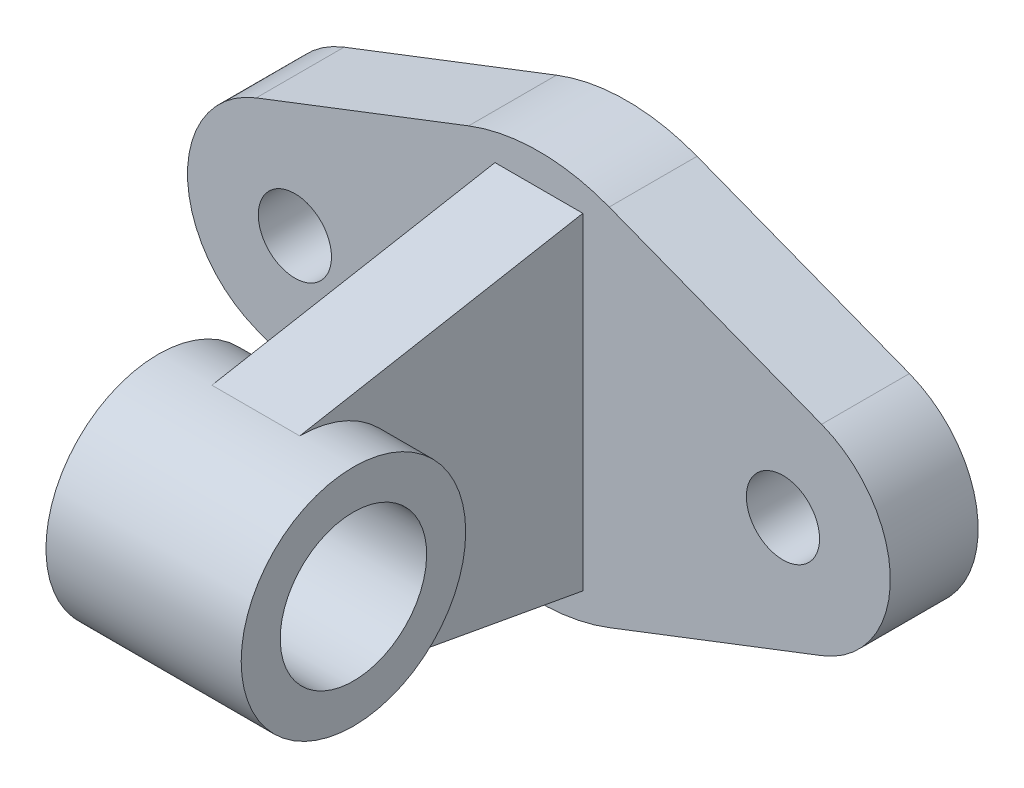
ISO-10303-21;
HEADER;
FILE_DESCRIPTION(('STEP AP214'),'2;1');
FILE_NAME('part.step','',(''),(''),'','','');
FILE_SCHEMA(('AUTOMOTIVE_DESIGN { 1 0 10303 214 1 1 1 1 }'));
ENDSEC;
DATA;
#1=APPLICATION_CONTEXT('core data for automotive mechanical design processes');
#2=APPLICATION_PROTOCOL_DEFINITION('international standard','automotive_design',2000,#1);
#3=PRODUCT_CONTEXT('',#1,'mechanical');
#4=PRODUCT('Part','Part','',(#3));
#5=PRODUCT_RELATED_PRODUCT_CATEGORY('part','',(#4));
#6=PRODUCT_DEFINITION_FORMATION('','',#4);
#7=PRODUCT_DEFINITION_CONTEXT('part definition',#1,'design');
#8=PRODUCT_DEFINITION('design','',#6,#7);
#9=PRODUCT_DEFINITION_SHAPE('','',#8);
#10=(LENGTH_UNIT() NAMED_UNIT(*) SI_UNIT(.MILLI.,.METRE.));
#11=(NAMED_UNIT(*) PLANE_ANGLE_UNIT() SI_UNIT($,.RADIAN.));
#12=(NAMED_UNIT(*) SI_UNIT($,.STERADIAN.) SOLID_ANGLE_UNIT());
#13=UNCERTAINTY_MEASURE_WITH_UNIT(LENGTH_MEASURE(1.E-05),#10,'distance_accuracy_value','');
#14=(GEOMETRIC_REPRESENTATION_CONTEXT(3) GLOBAL_UNCERTAINTY_ASSIGNED_CONTEXT((#13)) GLOBAL_UNIT_ASSIGNED_CONTEXT((#10,
#11,#12)) REPRESENTATION_CONTEXT('',''));
#15=CARTESIAN_POINT('',(0.,0.,0.));
#16=DIRECTION('',(0.,0.,1.));
#17=DIRECTION('',(1.,0.,0.));
#18=AXIS2_PLACEMENT_3D('',#15,#16,#17);
#19=CARTESIAN_POINT('',(-49.9999999999996,6.3309218839569E-06,18.));
#20=DIRECTION('',(0.,0.,1.));
#21=DIRECTION('',(1.,0.,0.));
#22=AXIS2_PLACEMENT_3D('',#19,#20,#21);
#23=PLANE('',#22);
#24=CARTESIAN_POINT('',(50.0000000000004,6.3309218839569E-06,18.));
#25=DIRECTION('',(0.,0.,1.));
#26=DIRECTION('',(1.,0.,0.));
#27=AXIS2_PLACEMENT_3D('',#24,#25,#26);
#28=CIRCLE('',#27,7.5);
#29=CARTESIAN_POINT('',(57.5000000000004,6.3309218839569E-06,18.));
#30=VERTEX_POINT('',#29);
#31=EDGE_CURVE('E283',#30,#30,#28,.T.);
#32=ORIENTED_EDGE('',*,*,#31,.F.);
#33=EDGE_LOOP('',(#32));
#34=FACE_BOUND('',#33,.T.);
#35=CARTESIAN_POINT('',(-49.9999999999996,6.3309218839569E-06,18.));
#36=DIRECTION('',(0.,0.,1.));
#37=DIRECTION('',(1.,0.,0.));
#38=AXIS2_PLACEMENT_3D('',#35,#36,#37);
#39=CIRCLE('',#38,7.5);
#40=CARTESIAN_POINT('',(-42.4999999999996,6.3309218839569E-06,18.));
#41=VERTEX_POINT('',#40);
#42=EDGE_CURVE('E275',#41,#41,#39,.T.);
#43=ORIENTED_EDGE('',*,*,#42,.F.);
#44=EDGE_LOOP('',(#43));
#45=FACE_BOUND('',#44,.T.);
#46=DIRECTION('',(0.932952257592603,-0.36000011812896,0.));
#47=VECTOR('',#46,1.);
#48=CARTESIAN_POINT('',(-14.4000047251584,-37.3180903037041,18.));
#49=LINE('',#48,#47);
#50=CARTESIAN_POINT('',(-57.9200025988367,-20.5249433361154,18.));
#51=VERTEX_POINT('',#50);
#52=CARTESIAN_POINT('',(-14.4000047251584,-37.3180903037041,18.));
#53=VERTEX_POINT('',#52);
#54=EDGE_CURVE('E161',#51,#53,#49,.T.);
#55=ORIENTED_EDGE('',*,*,#54,.T.);
#56=CARTESIAN_POINT('',(0.,0.,18.));
#57=DIRECTION('',(0.,0.,1.));
#58=DIRECTION('',(1.,0.,0.));
#59=AXIS2_PLACEMENT_3D('',#56,#57,#58);
#60=CIRCLE('',#59,40.);
#61=CARTESIAN_POINT('',(14.3999952748411,-37.3180939503152,18.));
#62=VERTEX_POINT('',#61);
#63=EDGE_CURVE('E165',#53,#62,#60,.T.);
#64=ORIENTED_EDGE('',*,*,#63,.T.);
#65=DIRECTION('',(0.932952257592615,0.360000118128929,0.));
#66=VECTOR('',#65,1.);
#67=CARTESIAN_POINT('',(14.3999952748411,-37.3180939503152,18.));
#68=LINE('',#67,#66);
#69=CARTESIAN_POINT('',(57.9200025988368,-20.5249433361156,18.));
#70=VERTEX_POINT('',#69);
#71=EDGE_CURVE('E168',#62,#70,#68,.T.);
#72=ORIENTED_EDGE('',*,*,#71,.T.);
#73=CARTESIAN_POINT('',(50.0000000000004,6.3309218839569E-06,18.));
#74=DIRECTION('',(0.,0.,1.));
#75=DIRECTION('',(1.,0.,0.));
#76=AXIS2_PLACEMENT_3D('',#73,#74,#75);
#77=CIRCLE('',#76,22.);
#78=CARTESIAN_POINT('',(57.919997401163,20.5249580035952,18.));
#79=VERTEX_POINT('',#78);
#80=EDGE_CURVE('E171',#70,#79,#77,.T.);
#81=ORIENTED_EDGE('',*,*,#80,.T.);
#82=DIRECTION('',(-0.93295234875788,0.359999881871028,0.));
#83=VECTOR('',#82,1.);
#84=CARTESIAN_POINT('',(57.919997401163,20.5249580035952,18.));
#85=LINE('',#84,#83);
#86=CARTESIAN_POINT('',(14.3999952748411,37.3180939503152,18.));
#87=VERTEX_POINT('',#86);
#88=EDGE_CURVE('E174',#79,#87,#85,.T.);
#89=ORIENTED_EDGE('',*,*,#88,.T.);
#90=CARTESIAN_POINT('',(0.,0.,18.));
#91=DIRECTION('',(0.,0.,1.));
#92=DIRECTION('',(1.,0.,0.));
#93=AXIS2_PLACEMENT_3D('',#90,#91,#92);
#94=CIRCLE('',#93,40.);
#95=CARTESIAN_POINT('',(-14.3999952748414,37.3180939503151,18.));
#96=VERTEX_POINT('',#95);
#97=EDGE_CURVE('E177',#87,#96,#94,.T.);
#98=ORIENTED_EDGE('',*,*,#97,.T.);
#99=DIRECTION('',(-0.932952348757878,-0.359999881871034,0.));
#100=VECTOR('',#99,1.);
#101=CARTESIAN_POINT('',(-57.9199974011623,20.5249580035952,18.));
#102=LINE('',#101,#100);
#103=CARTESIAN_POINT('',(-57.9199974011623,20.5249580035952,18.));
#104=VERTEX_POINT('',#103);
#105=EDGE_CURVE('E180',#96,#104,#102,.T.);
#106=ORIENTED_EDGE('',*,*,#105,.T.);
#107=CARTESIAN_POINT('',(-49.9999999999996,6.3309218839569E-06,18.));
#108=DIRECTION('',(0.,0.,1.));
#109=DIRECTION('',(1.,0.,0.));
#110=AXIS2_PLACEMENT_3D('',#107,#108,#109);
#111=CIRCLE('',#110,22.);
#112=EDGE_CURVE('E157',#104,#51,#111,.T.);
#113=ORIENTED_EDGE('',*,*,#112,.T.);
#114=EDGE_LOOP('',(#55,#64,#72,#81,#89,#98,#106,#113));
#115=FACE_BOUND('',#114,.T.);
#116=DIRECTION('',(1.,0.,0.));
#117=VECTOR('',#116,1.);
#118=CARTESIAN_POINT('',(9.00000000000001,-33.5,18.));
#119=LINE('',#118,#117);
#120=CARTESIAN_POINT('',(-9.00000000000002,-33.5,18.));
#121=VERTEX_POINT('',#120);
#122=CARTESIAN_POINT('',(9.00000000000001,-33.5,18.));
#123=VERTEX_POINT('',#122);
#124=EDGE_CURVE('E126',#121,#123,#119,.T.);
#125=ORIENTED_EDGE('',*,*,#124,.F.);
#126=DIRECTION('',(0.,-1.,0.));
#127=VECTOR('',#126,1.);
#128=CARTESIAN_POINT('',(-9.00000000000001,33.5,18.));
#129=LINE('',#128,#127);
#130=CARTESIAN_POINT('',(-9.00000000000004,33.5,18.));
#131=VERTEX_POINT('',#130);
#132=EDGE_CURVE('E136',#131,#121,#129,.T.);
#133=ORIENTED_EDGE('',*,*,#132,.F.);
#134=DIRECTION('',(-1.,0.,0.));
#135=VECTOR('',#134,1.);
#136=CARTESIAN_POINT('',(8.99999999999999,33.5,18.));
#137=LINE('',#136,#135);
#138=CARTESIAN_POINT('',(8.99999999999999,33.5,18.));
#139=VERTEX_POINT('',#138);
#140=EDGE_CURVE('E149',#139,#131,#137,.T.);
#141=ORIENTED_EDGE('',*,*,#140,.F.);
#142=DIRECTION('',(0.,1.,0.));
#143=VECTOR('',#142,1.);
#144=CARTESIAN_POINT('',(8.99999999999999,33.5,18.));
#145=LINE('',#144,#143);
#146=EDGE_CURVE('E135',#123,#139,#145,.T.);
#147=ORIENTED_EDGE('',*,*,#146,.F.);
#148=EDGE_LOOP('',(#125,#133,#141,#147));
#149=FACE_BOUND('',#148,.T.);
#150=ADVANCED_FACE('F39',(#34,#45,#115,#149),#23,.T.);
#151=CARTESIAN_POINT('',(-49.9999999999996,6.3309218839569E-06,18.));
#152=DIRECTION('',(0.,0.,-1.));
#153=DIRECTION('',(-1.,0.,0.));
#154=AXIS2_PLACEMENT_3D('',#151,#152,#153);
#155=CYLINDRICAL_SURFACE('',#154,22.);
#156=CARTESIAN_POINT('',(-49.9999999999996,6.3309218839569E-06,0.));
#157=DIRECTION('',(0.,0.,1.));
#158=DIRECTION('',(1.,0.,0.));
#159=AXIS2_PLACEMENT_3D('',#156,#157,#158);
#160=CIRCLE('',#159,22.);
#161=CARTESIAN_POINT('',(-57.9199974011623,20.5249580035952,0.));
#162=VERTEX_POINT('',#161);
#163=CARTESIAN_POINT('',(-57.9200025988367,-20.5249433361154,0.));
#164=VERTEX_POINT('',#163);
#165=EDGE_CURVE('E153',#162,#164,#160,.T.);
#166=ORIENTED_EDGE('',*,*,#165,.T.);
#167=DIRECTION('',(0.,0.,-1.));
#168=VECTOR('',#167,1.);
#169=CARTESIAN_POINT('',(-57.9200025988367,-20.5249433361154,18.));
#170=LINE('',#169,#168);
#171=EDGE_CURVE('E234',#51,#164,#170,.T.);
#172=ORIENTED_EDGE('',*,*,#171,.F.);
#173=ORIENTED_EDGE('',*,*,#112,.F.);
#174=DIRECTION('',(0.,0.,-1.));
#175=VECTOR('',#174,1.);
#176=CARTESIAN_POINT('',(-57.9199974011623,20.5249580035952,18.));
#177=LINE('',#176,#175);
#178=EDGE_CURVE('E183',#104,#162,#177,.T.);
#179=ORIENTED_EDGE('',*,*,#178,.T.);
#180=EDGE_LOOP('',(#166,#172,#173,#179));
#181=FACE_BOUND('',#180,.T.);
#182=ADVANCED_FACE('F41',(#181),#155,.T.);
#183=CARTESIAN_POINT('',(-14.4000047251584,-37.3180903037041,18.));
#184=DIRECTION('',(0.36000011812896,0.932952257592603,0.));
#185=DIRECTION('',(-0.932952257592603,0.36000011812896,0.));
#186=AXIS2_PLACEMENT_3D('',#183,#184,#185);
#187=PLANE('',#186);
#188=DIRECTION('',(0.932952257592603,-0.36000011812896,0.));
#189=VECTOR('',#188,1.);
#190=CARTESIAN_POINT('',(-14.4000047251584,-37.3180903037041,0.));
#191=LINE('',#190,#189);
#192=CARTESIAN_POINT('',(-14.4000047251584,-37.3180903037041,0.));
#193=VERTEX_POINT('',#192);
#194=EDGE_CURVE('E187',#164,#193,#191,.T.);
#195=ORIENTED_EDGE('',*,*,#194,.T.);
#196=DIRECTION('',(0.,0.,-1.));
#197=VECTOR('',#196,1.);
#198=CARTESIAN_POINT('',(-14.4000047251584,-37.3180903037041,18.));
#199=LINE('',#198,#197);
#200=EDGE_CURVE('E230',#53,#193,#199,.T.);
#201=ORIENTED_EDGE('',*,*,#200,.F.);
#202=ORIENTED_EDGE('',*,*,#54,.F.);
#203=ORIENTED_EDGE('',*,*,#171,.T.);
#204=EDGE_LOOP('',(#195,#201,#202,#203));
#205=FACE_BOUND('',#204,.T.);
#206=ADVANCED_FACE('F312',(#205),#187,.F.);
#207=CARTESIAN_POINT('',(0.,0.,18.));
#208=DIRECTION('',(0.,0.,-1.));
#209=DIRECTION('',(-1.,0.,0.));
#210=AXIS2_PLACEMENT_3D('',#207,#208,#209);
#211=CYLINDRICAL_SURFACE('',#210,40.);
#212=CARTESIAN_POINT('',(0.,0.,0.));
#213=DIRECTION('',(0.,0.,1.));
#214=DIRECTION('',(1.,0.,0.));
#215=AXIS2_PLACEMENT_3D('',#212,#213,#214);
#216=CIRCLE('',#215,40.);
#217=CARTESIAN_POINT('',(14.3999952748411,-37.3180939503152,0.));
#218=VERTEX_POINT('',#217);
#219=EDGE_CURVE('E190',#193,#218,#216,.T.);
#220=ORIENTED_EDGE('',*,*,#219,.T.);
#221=DIRECTION('',(0.,0.,-1.));
#222=VECTOR('',#221,1.);
#223=CARTESIAN_POINT('',(14.3999952748411,-37.3180939503152,18.));
#224=LINE('',#223,#222);
#225=EDGE_CURVE('E226',#62,#218,#224,.T.);
#226=ORIENTED_EDGE('',*,*,#225,.F.);
#227=ORIENTED_EDGE('',*,*,#63,.F.);
#228=ORIENTED_EDGE('',*,*,#200,.T.);
#229=EDGE_LOOP('',(#220,#226,#227,#228));
#230=FACE_BOUND('',#229,.T.);
#231=ADVANCED_FACE('F315',(#230),#211,.T.);
#232=CARTESIAN_POINT('',(14.3999952748411,-37.3180939503152,18.));
#233=DIRECTION('',(-0.360000118128929,0.932952257592615,0.));
#234=DIRECTION('',(-0.932952257592615,-0.360000118128929,0.));
#235=AXIS2_PLACEMENT_3D('',#232,#233,#234);
#236=PLANE('',#235);
#237=DIRECTION('',(0.932952257592615,0.360000118128929,0.));
#238=VECTOR('',#237,1.);
#239=CARTESIAN_POINT('',(14.3999952748411,-37.3180939503152,0.));
#240=LINE('',#239,#238);
#241=CARTESIAN_POINT('',(57.9200025988368,-20.5249433361156,0.));
#242=VERTEX_POINT('',#241);
#243=EDGE_CURVE('E193',#218,#242,#240,.T.);
#244=ORIENTED_EDGE('',*,*,#243,.T.);
#245=DIRECTION('',(0.,0.,-1.));
#246=VECTOR('',#245,1.);
#247=CARTESIAN_POINT('',(57.9200025988368,-20.5249433361156,18.));
#248=LINE('',#247,#246);
#249=EDGE_CURVE('E222',#70,#242,#248,.T.);
#250=ORIENTED_EDGE('',*,*,#249,.F.);
#251=ORIENTED_EDGE('',*,*,#71,.F.);
#252=ORIENTED_EDGE('',*,*,#225,.T.);
#253=EDGE_LOOP('',(#244,#250,#251,#252));
#254=FACE_BOUND('',#253,.T.);
#255=ADVANCED_FACE('F320',(#254),#236,.F.);
#256=CARTESIAN_POINT('',(50.0000000000004,6.3309218839569E-06,18.));
#257=DIRECTION('',(0.,0.,-1.));
#258=DIRECTION('',(-1.,0.,0.));
#259=AXIS2_PLACEMENT_3D('',#256,#257,#258);
#260=CYLINDRICAL_SURFACE('',#259,22.);
#261=CARTESIAN_POINT('',(50.0000000000004,6.3309218839569E-06,0.));
#262=DIRECTION('',(0.,0.,1.));
#263=DIRECTION('',(1.,0.,0.));
#264=AXIS2_PLACEMENT_3D('',#261,#262,#263);
#265=CIRCLE('',#264,22.);
#266=CARTESIAN_POINT('',(57.919997401163,20.5249580035952,0.));
#267=VERTEX_POINT('',#266);
#268=EDGE_CURVE('E196',#242,#267,#265,.T.);
#269=ORIENTED_EDGE('',*,*,#268,.T.);
#270=DIRECTION('',(0.,0.,-1.));
#271=VECTOR('',#270,1.);
#272=CARTESIAN_POINT('',(57.919997401163,20.5249580035952,18.));
#273=LINE('',#272,#271);
#274=EDGE_CURVE('E218',#79,#267,#273,.T.);
#275=ORIENTED_EDGE('',*,*,#274,.F.);
#276=ORIENTED_EDGE('',*,*,#80,.F.);
#277=ORIENTED_EDGE('',*,*,#249,.T.);
#278=EDGE_LOOP('',(#269,#275,#276,#277));
#279=FACE_BOUND('',#278,.T.);
#280=ADVANCED_FACE('F326',(#279),#260,.T.);
#281=CARTESIAN_POINT('',(57.919997401163,20.5249580035952,18.));
#282=DIRECTION('',(-0.359999881871028,-0.93295234875788,0.));
#283=DIRECTION('',(0.93295234875788,-0.359999881871028,0.));
#284=AXIS2_PLACEMENT_3D('',#281,#282,#283);
#285=PLANE('',#284);
#286=DIRECTION('',(-0.93295234875788,0.359999881871028,0.));
#287=VECTOR('',#286,1.);
#288=CARTESIAN_POINT('',(57.919997401163,20.5249580035952,0.));
#289=LINE('',#288,#287);
#290=CARTESIAN_POINT('',(14.3999952748411,37.3180939503152,0.));
#291=VERTEX_POINT('',#290);
#292=EDGE_CURVE('E199',#267,#291,#289,.T.);
#293=ORIENTED_EDGE('',*,*,#292,.T.);
#294=DIRECTION('',(0.,0.,-1.));
#295=VECTOR('',#294,1.);
#296=CARTESIAN_POINT('',(14.3999952748411,37.3180939503152,18.));
#297=LINE('',#296,#295);
#298=EDGE_CURVE('E214',#87,#291,#297,.T.);
#299=ORIENTED_EDGE('',*,*,#298,.F.);
#300=ORIENTED_EDGE('',*,*,#88,.F.);
#301=ORIENTED_EDGE('',*,*,#274,.T.);
#302=EDGE_LOOP('',(#293,#299,#300,#301));
#303=FACE_BOUND('',#302,.T.);
#304=ADVANCED_FACE('F330',(#303),#285,.F.);
#305=CARTESIAN_POINT('',(0.,0.,18.));
#306=DIRECTION('',(0.,0.,-1.));
#307=DIRECTION('',(-1.,0.,0.));
#308=AXIS2_PLACEMENT_3D('',#305,#306,#307);
#309=CYLINDRICAL_SURFACE('',#308,40.);
#310=CARTESIAN_POINT('',(0.,0.,0.));
#311=DIRECTION('',(0.,0.,1.));
#312=DIRECTION('',(1.,0.,0.));
#313=AXIS2_PLACEMENT_3D('',#310,#311,#312);
#314=CIRCLE('',#313,40.);
#315=CARTESIAN_POINT('',(-14.3999952748414,37.3180939503151,0.));
#316=VERTEX_POINT('',#315);
#317=EDGE_CURVE('E202',#291,#316,#314,.T.);
#318=ORIENTED_EDGE('',*,*,#317,.T.);
#319=DIRECTION('',(0.,0.,-1.));
#320=VECTOR('',#319,1.);
#321=CARTESIAN_POINT('',(-14.3999952748414,37.3180939503151,18.));
#322=LINE('',#321,#320);
#323=EDGE_CURVE('E210',#96,#316,#322,.T.);
#324=ORIENTED_EDGE('',*,*,#323,.F.);
#325=ORIENTED_EDGE('',*,*,#97,.F.);
#326=ORIENTED_EDGE('',*,*,#298,.T.);
#327=EDGE_LOOP('',(#318,#324,#325,#326));
#328=FACE_BOUND('',#327,.T.);
#329=ADVANCED_FACE('F335',(#328),#309,.T.);
#330=CARTESIAN_POINT('',(-57.9199974011623,20.5249580035952,18.));
#331=DIRECTION('',(0.359999881871034,-0.932952348757878,0.));
#332=DIRECTION('',(0.932952348757878,0.359999881871034,0.));
#333=AXIS2_PLACEMENT_3D('',#330,#331,#332);
#334=PLANE('',#333);
#335=DIRECTION('',(-0.932952348757878,-0.359999881871034,0.));
#336=VECTOR('',#335,1.);
#337=CARTESIAN_POINT('',(-57.9199974011623,20.5249580035952,0.));
#338=LINE('',#337,#336);
#339=EDGE_CURVE('E162',#316,#162,#338,.T.);
#340=ORIENTED_EDGE('',*,*,#339,.T.);
#341=ORIENTED_EDGE('',*,*,#178,.F.);
#342=ORIENTED_EDGE('',*,*,#105,.F.);
#343=ORIENTED_EDGE('',*,*,#323,.T.);
#344=EDGE_LOOP('',(#340,#341,#342,#343));
#345=FACE_BOUND('',#344,.T.);
#346=ADVANCED_FACE('F339',(#345),#334,.F.);
#347=CARTESIAN_POINT('',(-49.9999999999996,6.3309218839569E-06,0.));
#348=DIRECTION('',(0.,0.,1.));
#349=DIRECTION('',(1.,0.,0.));
#350=AXIS2_PLACEMENT_3D('',#347,#348,#349);
#351=PLANE('',#350);
#352=CARTESIAN_POINT('',(50.0000000000004,6.3309218839569E-06,0.));
#353=DIRECTION('',(0.,0.,1.));
#354=DIRECTION('',(1.,0.,0.));
#355=AXIS2_PLACEMENT_3D('',#352,#353,#354);
#356=CIRCLE('',#355,7.5);
#357=CARTESIAN_POINT('',(57.5000000000004,6.3309218839569E-06,0.));
#358=VERTEX_POINT('',#357);
#359=EDGE_CURVE('E273',#358,#358,#356,.T.);
#360=ORIENTED_EDGE('',*,*,#359,.T.);
#361=EDGE_LOOP('',(#360));
#362=FACE_BOUND('',#361,.T.);
#363=CARTESIAN_POINT('',(-49.9999999999996,6.3309218839569E-06,0.));
#364=DIRECTION('',(0.,0.,1.));
#365=DIRECTION('',(1.,0.,0.));
#366=AXIS2_PLACEMENT_3D('',#363,#364,#365);
#367=CIRCLE('',#366,7.5);
#368=CARTESIAN_POINT('',(-42.4999999999996,6.3309218839569E-06,0.));
#369=VERTEX_POINT('',#368);
#370=EDGE_CURVE('E279',#369,#369,#367,.T.);
#371=ORIENTED_EDGE('',*,*,#370,.T.);
#372=EDGE_LOOP('',(#371));
#373=FACE_BOUND('',#372,.T.);
#374=ORIENTED_EDGE('',*,*,#165,.F.);
#375=ORIENTED_EDGE('',*,*,#339,.F.);
#376=ORIENTED_EDGE('',*,*,#317,.F.);
#377=ORIENTED_EDGE('',*,*,#292,.F.);
#378=ORIENTED_EDGE('',*,*,#268,.F.);
#379=ORIENTED_EDGE('',*,*,#243,.F.);
#380=ORIENTED_EDGE('',*,*,#219,.F.);
#381=ORIENTED_EDGE('',*,*,#194,.F.);
#382=EDGE_LOOP('',(#374,#375,#376,#377,#378,#379,#380,#381));
#383=FACE_BOUND('',#382,.T.);
#384=ADVANCED_FACE('F291',(#362,#373,#383),#351,.F.);
#385=CARTESIAN_POINT('',(-9.00000000000001,33.5,76.));
#386=DIRECTION('',(1.,0.,0.));
#387=DIRECTION('',(0.,1.,0.));
#388=AXIS2_PLACEMENT_3D('',#385,#386,#387);
#389=PLANE('',#388);
#390=ORIENTED_EDGE('',*,*,#132,.T.);
#391=DIRECTION('',(0.,0.178138899892442,0.984005351786824));
#392=VECTOR('',#391,1.);
#393=CARTESIAN_POINT('',(-9.,-21.2070590774987,85.9038641433403));
#394=LINE('',#393,#392);
#395=CARTESIAN_POINT('',(-9.00000000000004,-23.,76.));
#396=VERTEX_POINT('',#395);
#397=EDGE_CURVE('E129',#121,#396,#394,.T.);
#398=ORIENTED_EDGE('',*,*,#397,.T.);
#399=CARTESIAN_POINT('',(-9.,0.,76.));
#400=DIRECTION('',(1.,0.,0.));
#401=DIRECTION('',(0.,1.,0.));
#402=AXIS2_PLACEMENT_3D('',#399,#400,#401);
#403=CIRCLE('',#402,23.);
#404=CARTESIAN_POINT('',(-9.,23.,76.));
#405=VERTEX_POINT('',#404);
#406=EDGE_CURVE('E242',#396,#405,#403,.T.);
#407=ORIENTED_EDGE('',*,*,#406,.T.);
#408=DIRECTION('',(0.,0.178138899892442,-0.984005351786824));
#409=VECTOR('',#408,1.);
#410=CARTESIAN_POINT('',(-9.,23.3332014103763,74.1594588760164));
#411=LINE('',#410,#409);
#412=EDGE_CURVE('E62',#405,#131,#411,.T.);
#413=ORIENTED_EDGE('',*,*,#412,.T.);
#414=EDGE_LOOP('',(#390,#398,#407,#413));
#415=FACE_BOUND('',#414,.T.);
#416=ADVANCED_FACE('F241',(#415),#389,.F.);
#417=CARTESIAN_POINT('',(8.99999999999999,33.5,76.));
#418=DIRECTION('',(-1.,0.,0.));
#419=DIRECTION('',(0.,-1.,0.));
#420=AXIS2_PLACEMENT_3D('',#417,#418,#419);
#421=PLANE('',#420);
#422=CARTESIAN_POINT('',(9.,0.,76.));
#423=DIRECTION('',(-1.,0.,0.));
#424=DIRECTION('',(0.,-1.,0.));
#425=AXIS2_PLACEMENT_3D('',#422,#423,#424);
#426=CIRCLE('',#425,23.);
#427=CARTESIAN_POINT('',(9.,23.,76.));
#428=VERTEX_POINT('',#427);
#429=CARTESIAN_POINT('',(9.,-23.,76.));
#430=VERTEX_POINT('',#429);
#431=EDGE_CURVE('E144',#428,#430,#426,.T.);
#432=ORIENTED_EDGE('',*,*,#431,.T.);
#433=DIRECTION('',(0.,0.178138899892442,0.984005351786824));
#434=VECTOR('',#433,1.);
#435=CARTESIAN_POINT('',(9.00000000000001,-33.5,18.));
#436=LINE('',#435,#434);
#437=EDGE_CURVE('E55',#123,#430,#436,.T.);
#438=ORIENTED_EDGE('',*,*,#437,.F.);
#439=ORIENTED_EDGE('',*,*,#146,.T.);
#440=DIRECTION('',(0.,0.178138899892442,-0.984005351786824));
#441=VECTOR('',#440,1.);
#442=CARTESIAN_POINT('',(8.99999999999999,33.5,18.));
#443=LINE('',#442,#441);
#444=EDGE_CURVE('E147',#428,#139,#443,.T.);
#445=ORIENTED_EDGE('',*,*,#444,.F.);
#446=EDGE_LOOP('',(#432,#438,#439,#445));
#447=FACE_BOUND('',#446,.T.);
#448=ADVANCED_FACE('F140',(#447),#421,.F.);
#449=CARTESIAN_POINT('',(-20.,0.,76.));
#450=DIRECTION('',(1.,0.,0.));
#451=DIRECTION('',(0.,1.,0.));
#452=AXIS2_PLACEMENT_3D('',#449,#450,#451);
#453=CYLINDRICAL_SURFACE('',#452,23.);
#454=ORIENTED_EDGE('',*,*,#406,.F.);
#455=DIRECTION('',(1.,0.,0.));
#456=VECTOR('',#455,1.);
#457=CARTESIAN_POINT('',(-20.,-23.,76.));
#458=LINE('',#457,#456);
#459=EDGE_CURVE('E48',#430,#396,#458,.F.);
#460=ORIENTED_EDGE('',*,*,#459,.F.);
#461=ORIENTED_EDGE('',*,*,#431,.F.);
#462=DIRECTION('',(1.,0.,0.));
#463=VECTOR('',#462,1.);
#464=CARTESIAN_POINT('',(-20.,23.,76.));
#465=LINE('',#464,#463);
#466=EDGE_CURVE('E11',#405,#428,#465,.T.);
#467=ORIENTED_EDGE('',*,*,#466,.F.);
#468=EDGE_LOOP('',(#454,#460,#461,#467));
#469=FACE_BOUND('',#468,.T.);
#470=CARTESIAN_POINT('',(-20.,0.,76.));
#471=DIRECTION('',(1.,0.,0.));
#472=DIRECTION('',(0.,1.,0.));
#473=AXIS2_PLACEMENT_3D('',#470,#471,#472);
#474=CIRCLE('',#473,23.);
#475=CARTESIAN_POINT('',(-20.,23.,76.));
#476=VERTEX_POINT('',#475);
#477=EDGE_CURVE('E250',#476,#476,#474,.T.);
#478=ORIENTED_EDGE('',*,*,#477,.T.);
#479=EDGE_LOOP('',(#478));
#480=FACE_BOUND('',#479,.T.);
#481=CARTESIAN_POINT('',(20.,0.,76.));
#482=DIRECTION('',(-1.,0.,0.));
#483=DIRECTION('',(0.,-1.,0.));
#484=AXIS2_PLACEMENT_3D('',#481,#482,#483);
#485=CIRCLE('',#484,23.);
#486=CARTESIAN_POINT('',(20.,-23.,76.));
#487=VERTEX_POINT('',#486);
#488=EDGE_CURVE('E259',#487,#487,#485,.T.);
#489=ORIENTED_EDGE('',*,*,#488,.T.);
#490=EDGE_LOOP('',(#489));
#491=FACE_BOUND('',#490,.T.);
#492=ADVANCED_FACE('F247',(#469,#480,#491),#453,.T.);
#493=CARTESIAN_POINT('',(-20.,0.,76.));
#494=DIRECTION('',(1.,0.,0.));
#495=DIRECTION('',(0.,1.,0.));
#496=AXIS2_PLACEMENT_3D('',#493,#494,#495);
#497=PLANE('',#496);
#498=CARTESIAN_POINT('',(-20.,0.,76.));
#499=DIRECTION('',(1.,0.,0.));
#500=DIRECTION('',(0.,1.,0.));
#501=AXIS2_PLACEMENT_3D('',#498,#499,#500);
#502=CIRCLE('',#501,15.);
#503=CARTESIAN_POINT('',(-20.,15.,76.));
#504=VERTEX_POINT('',#503);
#505=EDGE_CURVE('E263',#504,#504,#502,.T.);
#506=ORIENTED_EDGE('',*,*,#505,.T.);
#507=EDGE_LOOP('',(#506));
#508=FACE_BOUND('',#507,.T.);
#509=ORIENTED_EDGE('',*,*,#477,.F.);
#510=EDGE_LOOP('',(#509));
#511=FACE_BOUND('',#510,.T.);
#512=ADVANCED_FACE('F425',(#508,#511),#497,.F.);
#513=CARTESIAN_POINT('',(20.,0.,76.));
#514=DIRECTION('',(-1.,0.,0.));
#515=DIRECTION('',(0.,-1.,0.));
#516=AXIS2_PLACEMENT_3D('',#513,#514,#515);
#517=PLANE('',#516);
#518=CARTESIAN_POINT('',(20.,0.,76.));
#519=DIRECTION('',(1.,0.,0.));
#520=DIRECTION('',(0.,1.,0.));
#521=AXIS2_PLACEMENT_3D('',#518,#519,#520);
#522=CIRCLE('',#521,15.);
#523=CARTESIAN_POINT('',(20.,15.,76.));
#524=VERTEX_POINT('',#523);
#525=EDGE_CURVE('E245',#524,#524,#522,.T.);
#526=ORIENTED_EDGE('',*,*,#525,.F.);
#527=EDGE_LOOP('',(#526));
#528=FACE_BOUND('',#527,.T.);
#529=ORIENTED_EDGE('',*,*,#488,.F.);
#530=EDGE_LOOP('',(#529));
#531=FACE_BOUND('',#530,.T.);
#532=ADVANCED_FACE('F417',(#528,#531),#517,.F.);
#533=CARTESIAN_POINT('',(-71.9999999999996,0.,76.));
#534=DIRECTION('',(1.,0.,0.));
#535=DIRECTION('',(0.,1.,0.));
#536=AXIS2_PLACEMENT_3D('',#533,#534,#535);
#537=CYLINDRICAL_SURFACE('',#536,15.);
#538=ORIENTED_EDGE('',*,*,#525,.T.);
#539=EDGE_LOOP('',(#538));
#540=FACE_BOUND('',#539,.T.);
#541=ORIENTED_EDGE('',*,*,#505,.F.);
#542=EDGE_LOOP('',(#541));
#543=FACE_BOUND('',#542,.T.);
#544=ADVANCED_FACE('F409',(#540,#543),#537,.F.);
#545=CARTESIAN_POINT('',(-71.9999999999996,33.5,18.));
#546=DIRECTION('',(0.,-0.984005351786824,-0.178138899892442));
#547=DIRECTION('',(0.,0.178138899892442,-0.984005351786824));
#548=AXIS2_PLACEMENT_3D('',#545,#546,#547);
#549=PLANE('',#548);
#550=ORIENTED_EDGE('',*,*,#466,.T.);
#551=ORIENTED_EDGE('',*,*,#444,.T.);
#552=ORIENTED_EDGE('',*,*,#140,.T.);
#553=ORIENTED_EDGE('',*,*,#412,.F.);
#554=EDGE_LOOP('',(#550,#551,#552,#553));
#555=FACE_BOUND('',#554,.T.);
#556=ADVANCED_FACE('F405',(#555),#549,.F.);
#557=CARTESIAN_POINT('',(-71.9999999999996,-33.5,18.));
#558=DIRECTION('',(0.,0.984005351786824,-0.178138899892442));
#559=DIRECTION('',(0.,0.178138899892442,0.984005351786824));
#560=AXIS2_PLACEMENT_3D('',#557,#558,#559);
#561=PLANE('',#560);
#562=ORIENTED_EDGE('',*,*,#124,.T.);
#563=ORIENTED_EDGE('',*,*,#437,.T.);
#564=ORIENTED_EDGE('',*,*,#459,.T.);
#565=ORIENTED_EDGE('',*,*,#397,.F.);
#566=EDGE_LOOP('',(#562,#563,#564,#565));
#567=FACE_BOUND('',#566,.T.);
#568=ADVANCED_FACE('F127',(#567),#561,.F.);
#569=CARTESIAN_POINT('',(-49.9999999999996,6.3309218839569E-06,0.));
#570=DIRECTION('',(0.,0.,1.));
#571=DIRECTION('',(1.,0.,0.));
#572=AXIS2_PLACEMENT_3D('',#569,#570,#571);
#573=CYLINDRICAL_SURFACE('',#572,7.5);
#574=ORIENTED_EDGE('',*,*,#370,.F.);
#575=EDGE_LOOP('',(#574));
#576=FACE_BOUND('',#575,.T.);
#577=ORIENTED_EDGE('',*,*,#42,.T.);
#578=EDGE_LOOP('',(#577));
#579=FACE_BOUND('',#578,.T.);
#580=ADVANCED_FACE('F297',(#576,#579),#573,.F.);
#581=CARTESIAN_POINT('',(50.0000000000004,6.3309218839569E-06,0.));
#582=DIRECTION('',(0.,0.,1.));
#583=DIRECTION('',(1.,0.,0.));
#584=AXIS2_PLACEMENT_3D('',#581,#582,#583);
#585=CYLINDRICAL_SURFACE('',#584,7.5);
#586=ORIENTED_EDGE('',*,*,#359,.F.);
#587=EDGE_LOOP('',(#586));
#588=FACE_BOUND('',#587,.T.);
#589=ORIENTED_EDGE('',*,*,#31,.T.);
#590=EDGE_LOOP('',(#589));
#591=FACE_BOUND('',#590,.T.);
#592=ADVANCED_FACE('F294',(#588,#591),#585,.F.);
#593=CLOSED_SHELL('',(#150,#182,#206,#231,#255,#280,#304,#329,#346,#384,#416,#448,#492,#512,
#532,#544,#556,#568,#580,#592));
#594=MANIFOLD_SOLID_BREP('B2',#593);
#595=ADVANCED_BREP_SHAPE_REPRESENTATION('',(#18,#594),#14);
#596=SHAPE_DEFINITION_REPRESENTATION(#9,#595);
ENDSEC;
END-ISO-10303-21;
